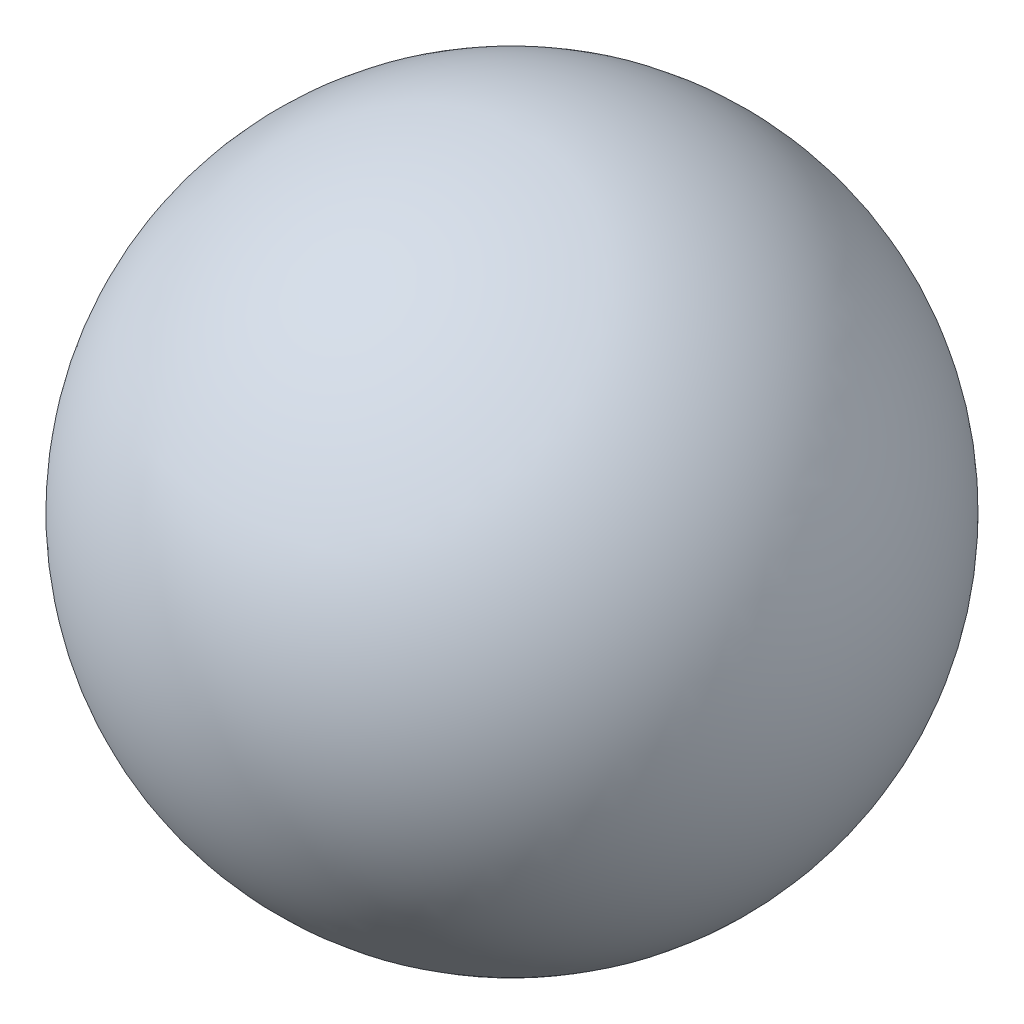
ISO-10303-21;
HEADER;
FILE_DESCRIPTION(('STEP AP214'),'2;1');
FILE_NAME('part.step','',(''),(''),'','','');
FILE_SCHEMA(('AUTOMOTIVE_DESIGN { 1 0 10303 214 1 1 1 1 }'));
ENDSEC;
DATA;
#1=APPLICATION_CONTEXT('core data for automotive mechanical design processes');
#2=APPLICATION_PROTOCOL_DEFINITION('international standard','automotive_design',2000,#1);
#3=PRODUCT_CONTEXT('',#1,'mechanical');
#4=PRODUCT('Part','Part','',(#3));
#5=PRODUCT_RELATED_PRODUCT_CATEGORY('part','',(#4));
#6=PRODUCT_DEFINITION_FORMATION('','',#4);
#7=PRODUCT_DEFINITION_CONTEXT('part definition',#1,'design');
#8=PRODUCT_DEFINITION('design','',#6,#7);
#9=PRODUCT_DEFINITION_SHAPE('','',#8);
#10=(LENGTH_UNIT() NAMED_UNIT(*) SI_UNIT(.MILLI.,.METRE.));
#11=(NAMED_UNIT(*) PLANE_ANGLE_UNIT() SI_UNIT($,.RADIAN.));
#12=(NAMED_UNIT(*) SI_UNIT($,.STERADIAN.) SOLID_ANGLE_UNIT());
#13=UNCERTAINTY_MEASURE_WITH_UNIT(LENGTH_MEASURE(1.E-05),#10,'distance_accuracy_value','');
#14=(GEOMETRIC_REPRESENTATION_CONTEXT(3) GLOBAL_UNCERTAINTY_ASSIGNED_CONTEXT((#13)) GLOBAL_UNIT_ASSIGNED_CONTEXT((#10,
#11,#12)) REPRESENTATION_CONTEXT('',''));
#15=CARTESIAN_POINT('',(0.,0.,0.));
#16=DIRECTION('',(0.,0.,1.));
#17=DIRECTION('',(1.,0.,0.));
#18=AXIS2_PLACEMENT_3D('',#15,#16,#17);
#19=CARTESIAN_POINT('',(0.,0.,0.));
#20=DIRECTION('',(0.,-1.,0.));
#21=DIRECTION('',(1.,0.,0.));
#22=AXIS2_PLACEMENT_3D('',#19,#20,#21);
#23=SPHERICAL_SURFACE('',#22,4.);
#24=CARTESIAN_POINT('',(0.,-3.70809924354783,0.));
#25=DIRECTION('',(0.,-1.,0.));
#26=DIRECTION('',(0.,0.,-1.));
#27=AXIS2_PLACEMENT_3D('',#24,#25,#26);
#28=CIRCLE('',#27,1.5);
#29=CARTESIAN_POINT('',(0.,-3.70809924354783,-1.5));
#30=VERTEX_POINT('',#29);
#31=EDGE_CURVE('E44',#30,#30,#28,.T.);
#32=ORIENTED_EDGE('',*,*,#31,.T.);
#33=EDGE_LOOP('',(#32));
#34=FACE_BOUND('',#33,.T.);
#35=ADVANCED_FACE('F37',(#34),#23,.F.);
#36=CARTESIAN_POINT('',(0.,0.,0.));
#37=DIRECTION('',(0.,-1.,0.));
#38=DIRECTION('',(1.,0.,0.));
#39=AXIS2_PLACEMENT_3D('',#36,#37,#38);
#40=SPHERICAL_SURFACE('',#39,5.);
#41=CARTESIAN_POINT('',(0.,-4.76969600708473,0.));
#42=DIRECTION('',(0.,-1.,0.));
#43=DIRECTION('',(0.,0.,-1.));
#44=AXIS2_PLACEMENT_3D('',#41,#42,#43);
#45=CIRCLE('',#44,1.5);
#46=CARTESIAN_POINT('',(0.,-4.76969600708473,-1.5));
#47=VERTEX_POINT('',#46);
#48=EDGE_CURVE('E10',#47,#47,#45,.T.);
#49=ORIENTED_EDGE('',*,*,#48,.F.);
#50=EDGE_LOOP('',(#49));
#51=FACE_BOUND('',#50,.T.);
#52=ADVANCED_FACE('F54',(#51),#40,.T.);
#53=CARTESIAN_POINT('',(0.,0.,0.));
#54=DIRECTION('',(0.,-1.,0.));
#55=DIRECTION('',(0.,0.,-1.));
#56=AXIS2_PLACEMENT_3D('',#53,#54,#55);
#57=CYLINDRICAL_SURFACE('',#56,1.5);
#58=ORIENTED_EDGE('',*,*,#48,.T.);
#59=EDGE_LOOP('',(#58));
#60=FACE_BOUND('',#59,.T.);
#61=ORIENTED_EDGE('',*,*,#31,.F.);
#62=EDGE_LOOP('',(#61));
#63=FACE_BOUND('',#62,.T.);
#64=ADVANCED_FACE('F52',(#60,#63),#57,.F.);
#65=CLOSED_SHELL('',(#35,#52,#64));
#66=MANIFOLD_SOLID_BREP('B2',#65);
#67=ADVANCED_BREP_SHAPE_REPRESENTATION('',(#18,#66),#14);
#68=SHAPE_DEFINITION_REPRESENTATION(#9,#67);
ENDSEC;
END-ISO-10303-21;
